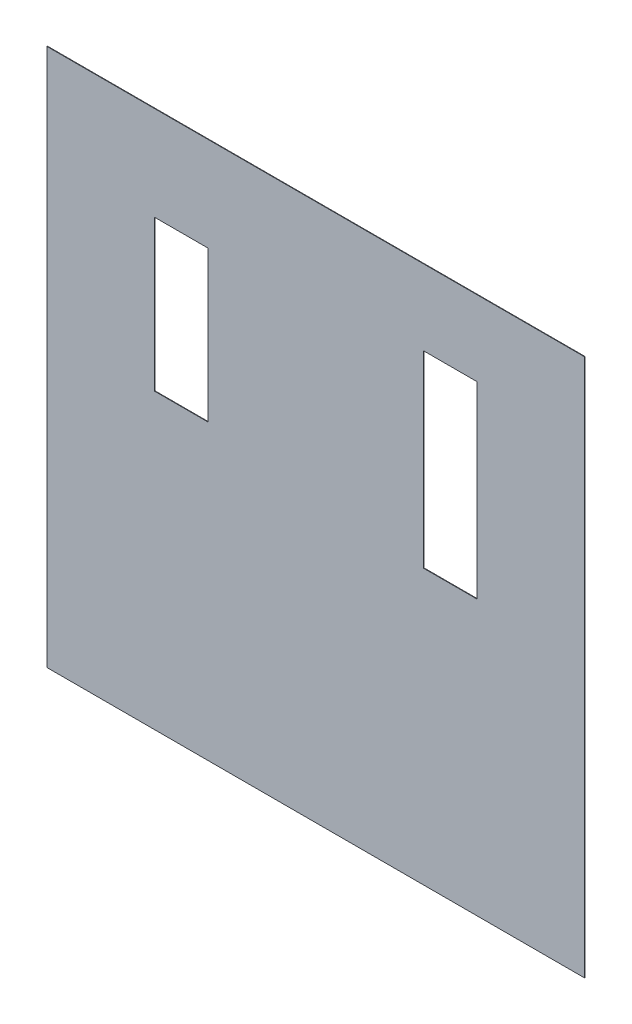
ISO-10303-21;
HEADER;
FILE_DESCRIPTION(('STEP AP214'),'2;1');
FILE_NAME('part.step','',(''),(''),'','','');
FILE_SCHEMA(('AUTOMOTIVE_DESIGN { 1 0 10303 214 1 1 1 1 }'));
ENDSEC;
DATA;
#1=APPLICATION_CONTEXT('core data for automotive mechanical design processes');
#2=APPLICATION_PROTOCOL_DEFINITION('international standard','automotive_design',2000,#1);
#3=PRODUCT_CONTEXT('',#1,'mechanical');
#4=PRODUCT('Part','Part','',(#3));
#5=PRODUCT_RELATED_PRODUCT_CATEGORY('part','',(#4));
#6=PRODUCT_DEFINITION_FORMATION('','',#4);
#7=PRODUCT_DEFINITION_CONTEXT('part definition',#1,'design');
#8=PRODUCT_DEFINITION('design','',#6,#7);
#9=PRODUCT_DEFINITION_SHAPE('','',#8);
#10=(LENGTH_UNIT() NAMED_UNIT(*) SI_UNIT(.MILLI.,.METRE.));
#11=(NAMED_UNIT(*) PLANE_ANGLE_UNIT() SI_UNIT($,.RADIAN.));
#12=(NAMED_UNIT(*) SI_UNIT($,.STERADIAN.) SOLID_ANGLE_UNIT());
#13=UNCERTAINTY_MEASURE_WITH_UNIT(LENGTH_MEASURE(1.E-05),#10,'distance_accuracy_value','');
#14=(GEOMETRIC_REPRESENTATION_CONTEXT(3) GLOBAL_UNCERTAINTY_ASSIGNED_CONTEXT((#13)) GLOBAL_UNIT_ASSIGNED_CONTEXT((#10,
#11,#12)) REPRESENTATION_CONTEXT('',''));
#15=CARTESIAN_POINT('',(0.,0.,0.));
#16=DIRECTION('',(0.,0.,1.));
#17=DIRECTION('',(1.,0.,0.));
#18=AXIS2_PLACEMENT_3D('',#15,#16,#17);
#19=CARTESIAN_POINT('',(0.,0.,0.0254));
#20=DIRECTION('',(1.,0.,0.));
#21=DIRECTION('',(0.,0.,-1.));
#22=AXIS2_PLACEMENT_3D('',#19,#20,#21);
#23=PLANE('',#22);
#24=DIRECTION('',(0.,-1.,0.));
#25=VECTOR('',#24,1.);
#26=CARTESIAN_POINT('',(0.,0.,0.));
#27=LINE('',#26,#25);
#28=CARTESIAN_POINT('',(0.,25.4,0.));
#29=VERTEX_POINT('',#28);
#30=CARTESIAN_POINT('',(0.,0.,0.));
#31=VERTEX_POINT('',#30);
#32=EDGE_CURVE('E183',#29,#31,#27,.T.);
#33=ORIENTED_EDGE('',*,*,#32,.T.);
#34=DIRECTION('',(0.,0.,-1.));
#35=VECTOR('',#34,1.);
#36=CARTESIAN_POINT('',(0.,0.,0.0254));
#37=LINE('',#36,#35);
#38=CARTESIAN_POINT('',(0.,0.,0.0254));
#39=VERTEX_POINT('',#38);
#40=EDGE_CURVE('E11',#39,#31,#37,.T.);
#41=ORIENTED_EDGE('',*,*,#40,.F.);
#42=DIRECTION('',(0.,-1.,0.));
#43=VECTOR('',#42,1.);
#44=CARTESIAN_POINT('',(0.,0.,0.0254));
#45=LINE('',#44,#43);
#46=CARTESIAN_POINT('',(0.,25.4,0.0254));
#47=VERTEX_POINT('',#46);
#48=EDGE_CURVE('E190',#47,#39,#45,.T.);
#49=ORIENTED_EDGE('',*,*,#48,.F.);
#50=DIRECTION('',(0.,0.,-1.));
#51=VECTOR('',#50,1.);
#52=CARTESIAN_POINT('',(0.,25.4,0.0254));
#53=LINE('',#52,#51);
#54=EDGE_CURVE('E200',#47,#29,#53,.T.);
#55=ORIENTED_EDGE('',*,*,#54,.T.);
#56=EDGE_LOOP('',(#33,#41,#49,#55));
#57=FACE_BOUND('',#56,.T.);
#58=ADVANCED_FACE('F33',(#57),#23,.F.);
#59=CARTESIAN_POINT('',(0.,0.,0.0254));
#60=DIRECTION('',(0.,1.,0.));
#61=DIRECTION('',(0.,0.,1.));
#62=AXIS2_PLACEMENT_3D('',#59,#60,#61);
#63=PLANE('',#62);
#64=DIRECTION('',(1.,0.,0.));
#65=VECTOR('',#64,1.);
#66=CARTESIAN_POINT('',(0.,0.,0.));
#67=LINE('',#66,#65);
#68=CARTESIAN_POINT('',(25.4,0.,0.));
#69=VERTEX_POINT('',#68);
#70=EDGE_CURVE('E203',#31,#69,#67,.T.);
#71=ORIENTED_EDGE('',*,*,#70,.T.);
#72=DIRECTION('',(0.,0.,-1.));
#73=VECTOR('',#72,1.);
#74=CARTESIAN_POINT('',(25.4,0.,0.0254));
#75=LINE('',#74,#73);
#76=CARTESIAN_POINT('',(25.4,0.,0.0254));
#77=VERTEX_POINT('',#76);
#78=EDGE_CURVE('E40',#77,#69,#75,.T.);
#79=ORIENTED_EDGE('',*,*,#78,.F.);
#80=DIRECTION('',(1.,0.,0.));
#81=VECTOR('',#80,1.);
#82=CARTESIAN_POINT('',(0.,0.,0.0254));
#83=LINE('',#82,#81);
#84=EDGE_CURVE('E193',#39,#77,#83,.T.);
#85=ORIENTED_EDGE('',*,*,#84,.F.);
#86=ORIENTED_EDGE('',*,*,#40,.T.);
#87=EDGE_LOOP('',(#71,#79,#85,#86));
#88=FACE_BOUND('',#87,.T.);
#89=ADVANCED_FACE('F232',(#88),#63,.F.);
#90=CARTESIAN_POINT('',(25.4,0.,0.0254));
#91=DIRECTION('',(-1.,0.,0.));
#92=DIRECTION('',(0.,0.,1.));
#93=AXIS2_PLACEMENT_3D('',#90,#91,#92);
#94=PLANE('',#93);
#95=DIRECTION('',(0.,1.,0.));
#96=VECTOR('',#95,1.);
#97=CARTESIAN_POINT('',(25.4,0.,0.));
#98=LINE('',#97,#96);
#99=CARTESIAN_POINT('',(25.4,25.4,0.));
#100=VERTEX_POINT('',#99);
#101=EDGE_CURVE('E205',#69,#100,#98,.T.);
#102=ORIENTED_EDGE('',*,*,#101,.T.);
#103=DIRECTION('',(0.,0.,-1.));
#104=VECTOR('',#103,1.);
#105=CARTESIAN_POINT('',(25.4,25.4,0.0254));
#106=LINE('',#105,#104);
#107=CARTESIAN_POINT('',(25.4,25.4,0.0254));
#108=VERTEX_POINT('',#107);
#109=EDGE_CURVE('E210',#108,#100,#106,.T.);
#110=ORIENTED_EDGE('',*,*,#109,.F.);
#111=DIRECTION('',(0.,1.,0.));
#112=VECTOR('',#111,1.);
#113=CARTESIAN_POINT('',(25.4,0.,0.0254));
#114=LINE('',#113,#112);
#115=EDGE_CURVE('E196',#77,#108,#114,.T.);
#116=ORIENTED_EDGE('',*,*,#115,.F.);
#117=ORIENTED_EDGE('',*,*,#78,.T.);
#118=EDGE_LOOP('',(#102,#110,#116,#117));
#119=FACE_BOUND('',#118,.T.);
#120=ADVANCED_FACE('F217',(#119),#94,.F.);
#121=CARTESIAN_POINT('',(0.,25.4,0.0254));
#122=DIRECTION('',(0.,-1.,0.));
#123=DIRECTION('',(0.,0.,-1.));
#124=AXIS2_PLACEMENT_3D('',#121,#122,#123);
#125=PLANE('',#124);
#126=DIRECTION('',(-1.,0.,0.));
#127=VECTOR('',#126,1.);
#128=CARTESIAN_POINT('',(0.,25.4,0.));
#129=LINE('',#128,#127);
#130=EDGE_CURVE('E194',#100,#29,#129,.T.);
#131=ORIENTED_EDGE('',*,*,#130,.T.);
#132=ORIENTED_EDGE('',*,*,#54,.F.);
#133=DIRECTION('',(-1.,0.,0.));
#134=VECTOR('',#133,1.);
#135=CARTESIAN_POINT('',(0.,25.4,0.0254));
#136=LINE('',#135,#134);
#137=EDGE_CURVE('E198',#108,#47,#136,.T.);
#138=ORIENTED_EDGE('',*,*,#137,.F.);
#139=ORIENTED_EDGE('',*,*,#109,.T.);
#140=EDGE_LOOP('',(#131,#132,#138,#139));
#141=FACE_BOUND('',#140,.T.);
#142=ADVANCED_FACE('F225',(#141),#125,.F.);
#143=CARTESIAN_POINT('',(0.,0.,0.0254));
#144=DIRECTION('',(0.,0.,-1.));
#145=DIRECTION('',(-1.,0.,0.));
#146=AXIS2_PLACEMENT_3D('',#143,#144,#145);
#147=PLANE('',#146);
#148=DIRECTION('',(1.,0.,0.));
#149=VECTOR('',#148,1.);
#150=CARTESIAN_POINT('',(17.78,12.954,0.0254));
#151=LINE('',#150,#149);
#152=CARTESIAN_POINT('',(17.78,12.954,0.0254));
#153=VERTEX_POINT('',#152);
#154=CARTESIAN_POINT('',(20.32,12.954,0.0254));
#155=VERTEX_POINT('',#154);
#156=EDGE_CURVE('E148',#153,#155,#151,.T.);
#157=ORIENTED_EDGE('',*,*,#156,.F.);
#158=DIRECTION('',(0.,-1.,0.));
#159=VECTOR('',#158,1.);
#160=CARTESIAN_POINT('',(17.78,21.844,0.0254));
#161=LINE('',#160,#159);
#162=CARTESIAN_POINT('',(17.78,21.844,0.0254));
#163=VERTEX_POINT('',#162);
#164=EDGE_CURVE('E47',#163,#153,#161,.T.);
#165=ORIENTED_EDGE('',*,*,#164,.F.);
#166=DIRECTION('',(-1.,0.,0.));
#167=VECTOR('',#166,1.);
#168=CARTESIAN_POINT('',(17.78,21.844,0.0254));
#169=LINE('',#168,#167);
#170=CARTESIAN_POINT('',(20.32,21.844,0.0254));
#171=VERTEX_POINT('',#170);
#172=EDGE_CURVE('E139',#171,#163,#169,.T.);
#173=ORIENTED_EDGE('',*,*,#172,.F.);
#174=DIRECTION('',(0.,1.,0.));
#175=VECTOR('',#174,1.);
#176=CARTESIAN_POINT('',(20.32,21.844,0.0254));
#177=LINE('',#176,#175);
#178=EDGE_CURVE('E142',#155,#171,#177,.T.);
#179=ORIENTED_EDGE('',*,*,#178,.F.);
#180=EDGE_LOOP('',(#157,#165,#173,#179));
#181=FACE_BOUND('',#180,.T.);
#182=DIRECTION('',(1.,0.,0.));
#183=VECTOR('',#182,1.);
#184=CARTESIAN_POINT('',(5.08,13.843,0.0254));
#185=LINE('',#184,#183);
#186=CARTESIAN_POINT('',(5.08,13.843,0.0254));
#187=VERTEX_POINT('',#186);
#188=CARTESIAN_POINT('',(7.62,13.843,0.0254));
#189=VERTEX_POINT('',#188);
#190=EDGE_CURVE('E173',#187,#189,#185,.T.);
#191=ORIENTED_EDGE('',*,*,#190,.F.);
#192=DIRECTION('',(0.,-1.,0.));
#193=VECTOR('',#192,1.);
#194=CARTESIAN_POINT('',(5.08,20.955,0.0254));
#195=LINE('',#194,#193);
#196=CARTESIAN_POINT('',(5.08,20.955,0.0254));
#197=VERTEX_POINT('',#196);
#198=EDGE_CURVE('E154',#197,#187,#195,.T.);
#199=ORIENTED_EDGE('',*,*,#198,.F.);
#200=DIRECTION('',(-1.,0.,0.));
#201=VECTOR('',#200,1.);
#202=CARTESIAN_POINT('',(5.08,20.955,0.0254));
#203=LINE('',#202,#201);
#204=CARTESIAN_POINT('',(7.62,20.955,0.0254));
#205=VERTEX_POINT('',#204);
#206=EDGE_CURVE('E162',#205,#197,#203,.T.);
#207=ORIENTED_EDGE('',*,*,#206,.F.);
#208=DIRECTION('',(0.,1.,0.));
#209=VECTOR('',#208,1.);
#210=CARTESIAN_POINT('',(7.62,20.955,0.0254));
#211=LINE('',#210,#209);
#212=EDGE_CURVE('E176',#189,#205,#211,.T.);
#213=ORIENTED_EDGE('',*,*,#212,.F.);
#214=EDGE_LOOP('',(#191,#199,#207,#213));
#215=FACE_BOUND('',#214,.T.);
#216=ORIENTED_EDGE('',*,*,#48,.T.);
#217=ORIENTED_EDGE('',*,*,#84,.T.);
#218=ORIENTED_EDGE('',*,*,#115,.T.);
#219=ORIENTED_EDGE('',*,*,#137,.T.);
#220=EDGE_LOOP('',(#216,#217,#218,#219));
#221=FACE_BOUND('',#220,.T.);
#222=ADVANCED_FACE('F231',(#181,#215,#221),#147,.F.);
#223=CARTESIAN_POINT('',(0.,0.,0.));
#224=DIRECTION('',(0.,0.,-1.));
#225=DIRECTION('',(-1.,0.,0.));
#226=AXIS2_PLACEMENT_3D('',#223,#224,#225);
#227=PLANE('',#226);
#228=DIRECTION('',(0.,-1.,0.));
#229=VECTOR('',#228,1.);
#230=CARTESIAN_POINT('',(17.78,21.844,0.));
#231=LINE('',#230,#229);
#232=CARTESIAN_POINT('',(17.78,21.844,0.));
#233=VERTEX_POINT('',#232);
#234=CARTESIAN_POINT('',(17.78,12.954,0.));
#235=VERTEX_POINT('',#234);
#236=EDGE_CURVE('E123',#233,#235,#231,.T.);
#237=ORIENTED_EDGE('',*,*,#236,.T.);
#238=DIRECTION('',(1.,0.,0.));
#239=VECTOR('',#238,1.);
#240=CARTESIAN_POINT('',(17.78,12.954,0.));
#241=LINE('',#240,#239);
#242=CARTESIAN_POINT('',(20.32,12.954,0.));
#243=VERTEX_POINT('',#242);
#244=EDGE_CURVE('E132',#235,#243,#241,.T.);
#245=ORIENTED_EDGE('',*,*,#244,.T.);
#246=DIRECTION('',(0.,1.,0.));
#247=VECTOR('',#246,1.);
#248=CARTESIAN_POINT('',(20.32,21.844,0.));
#249=LINE('',#248,#247);
#250=CARTESIAN_POINT('',(20.32,21.844,0.));
#251=VERTEX_POINT('',#250);
#252=EDGE_CURVE('E55',#243,#251,#249,.T.);
#253=ORIENTED_EDGE('',*,*,#252,.T.);
#254=DIRECTION('',(-1.,0.,0.));
#255=VECTOR('',#254,1.);
#256=CARTESIAN_POINT('',(17.78,21.844,0.));
#257=LINE('',#256,#255);
#258=EDGE_CURVE('E129',#251,#233,#257,.T.);
#259=ORIENTED_EDGE('',*,*,#258,.T.);
#260=EDGE_LOOP('',(#237,#245,#253,#259));
#261=FACE_BOUND('',#260,.T.);
#262=DIRECTION('',(0.,-1.,0.));
#263=VECTOR('',#262,1.);
#264=CARTESIAN_POINT('',(5.08,20.955,0.));
#265=LINE('',#264,#263);
#266=CARTESIAN_POINT('',(5.08,20.955,0.));
#267=VERTEX_POINT('',#266);
#268=CARTESIAN_POINT('',(5.08,13.843,0.));
#269=VERTEX_POINT('',#268);
#270=EDGE_CURVE('E158',#267,#269,#265,.T.);
#271=ORIENTED_EDGE('',*,*,#270,.T.);
#272=DIRECTION('',(1.,0.,0.));
#273=VECTOR('',#272,1.);
#274=CARTESIAN_POINT('',(5.08,13.843,0.));
#275=LINE('',#274,#273);
#276=CARTESIAN_POINT('',(7.62,13.843,0.));
#277=VERTEX_POINT('',#276);
#278=EDGE_CURVE('E161',#269,#277,#275,.T.);
#279=ORIENTED_EDGE('',*,*,#278,.T.);
#280=DIRECTION('',(0.,1.,0.));
#281=VECTOR('',#280,1.);
#282=CARTESIAN_POINT('',(7.62,20.955,0.));
#283=LINE('',#282,#281);
#284=CARTESIAN_POINT('',(7.62,20.955,0.));
#285=VERTEX_POINT('',#284);
#286=EDGE_CURVE('E165',#277,#285,#283,.T.);
#287=ORIENTED_EDGE('',*,*,#286,.T.);
#288=DIRECTION('',(-1.,0.,0.));
#289=VECTOR('',#288,1.);
#290=CARTESIAN_POINT('',(5.08,20.955,0.));
#291=LINE('',#290,#289);
#292=EDGE_CURVE('E168',#285,#267,#291,.T.);
#293=ORIENTED_EDGE('',*,*,#292,.T.);
#294=EDGE_LOOP('',(#271,#279,#287,#293));
#295=FACE_BOUND('',#294,.T.);
#296=ORIENTED_EDGE('',*,*,#32,.F.);
#297=ORIENTED_EDGE('',*,*,#130,.F.);
#298=ORIENTED_EDGE('',*,*,#101,.F.);
#299=ORIENTED_EDGE('',*,*,#70,.F.);
#300=EDGE_LOOP('',(#296,#297,#298,#299));
#301=FACE_BOUND('',#300,.T.);
#302=ADVANCED_FACE('F136',(#261,#295,#301),#227,.T.);
#303=CARTESIAN_POINT('',(5.08,20.955,0.));
#304=DIRECTION('',(-1.,0.,0.));
#305=DIRECTION('',(0.,-1.,0.));
#306=AXIS2_PLACEMENT_3D('',#303,#304,#305);
#307=PLANE('',#306);
#308=ORIENTED_EDGE('',*,*,#198,.T.);
#309=DIRECTION('',(0.,0.,1.));
#310=VECTOR('',#309,1.);
#311=CARTESIAN_POINT('',(5.08,13.843,0.));
#312=LINE('',#311,#310);
#313=EDGE_CURVE('E171',#269,#187,#312,.T.);
#314=ORIENTED_EDGE('',*,*,#313,.F.);
#315=ORIENTED_EDGE('',*,*,#270,.F.);
#316=DIRECTION('',(0.,0.,1.));
#317=VECTOR('',#316,1.);
#318=CARTESIAN_POINT('',(5.08,20.955,0.));
#319=LINE('',#318,#317);
#320=EDGE_CURVE('E181',#267,#197,#319,.T.);
#321=ORIENTED_EDGE('',*,*,#320,.T.);
#322=EDGE_LOOP('',(#308,#314,#315,#321));
#323=FACE_BOUND('',#322,.T.);
#324=ADVANCED_FACE('F244',(#323),#307,.F.);
#325=CARTESIAN_POINT('',(5.08,20.955,0.));
#326=DIRECTION('',(0.,1.,0.));
#327=DIRECTION('',(0.,0.,1.));
#328=AXIS2_PLACEMENT_3D('',#325,#326,#327);
#329=PLANE('',#328);
#330=ORIENTED_EDGE('',*,*,#206,.T.);
#331=ORIENTED_EDGE('',*,*,#320,.F.);
#332=ORIENTED_EDGE('',*,*,#292,.F.);
#333=DIRECTION('',(0.,0.,1.));
#334=VECTOR('',#333,1.);
#335=CARTESIAN_POINT('',(7.62,20.955,0.));
#336=LINE('',#335,#334);
#337=EDGE_CURVE('E184',#285,#205,#336,.T.);
#338=ORIENTED_EDGE('',*,*,#337,.T.);
#339=EDGE_LOOP('',(#330,#331,#332,#338));
#340=FACE_BOUND('',#339,.T.);
#341=ADVANCED_FACE('F250',(#340),#329,.F.);
#342=CARTESIAN_POINT('',(7.62,20.955,0.));
#343=DIRECTION('',(1.,0.,0.));
#344=DIRECTION('',(0.,1.,0.));
#345=AXIS2_PLACEMENT_3D('',#342,#343,#344);
#346=PLANE('',#345);
#347=ORIENTED_EDGE('',*,*,#212,.T.);
#348=ORIENTED_EDGE('',*,*,#337,.F.);
#349=ORIENTED_EDGE('',*,*,#286,.F.);
#350=DIRECTION('',(0.,0.,1.));
#351=VECTOR('',#350,1.);
#352=CARTESIAN_POINT('',(7.62,13.843,0.));
#353=LINE('',#352,#351);
#354=EDGE_CURVE('E186',#277,#189,#353,.T.);
#355=ORIENTED_EDGE('',*,*,#354,.T.);
#356=EDGE_LOOP('',(#347,#348,#349,#355));
#357=FACE_BOUND('',#356,.T.);
#358=ADVANCED_FACE('F255',(#357),#346,.F.);
#359=CARTESIAN_POINT('',(5.08,13.843,0.));
#360=DIRECTION('',(0.,-1.,0.));
#361=DIRECTION('',(0.,0.,-1.));
#362=AXIS2_PLACEMENT_3D('',#359,#360,#361);
#363=PLANE('',#362);
#364=ORIENTED_EDGE('',*,*,#190,.T.);
#365=ORIENTED_EDGE('',*,*,#354,.F.);
#366=ORIENTED_EDGE('',*,*,#278,.F.);
#367=ORIENTED_EDGE('',*,*,#313,.T.);
#368=EDGE_LOOP('',(#364,#365,#366,#367));
#369=FACE_BOUND('',#368,.T.);
#370=ADVANCED_FACE('F252',(#369),#363,.F.);
#371=CARTESIAN_POINT('',(17.78,21.844,0.));
#372=DIRECTION('',(-1.,0.,0.));
#373=DIRECTION('',(0.,-1.,0.));
#374=AXIS2_PLACEMENT_3D('',#371,#372,#373);
#375=PLANE('',#374);
#376=ORIENTED_EDGE('',*,*,#164,.T.);
#377=DIRECTION('',(0.,0.,1.));
#378=VECTOR('',#377,1.);
#379=CARTESIAN_POINT('',(17.78,12.954,0.));
#380=LINE('',#379,#378);
#381=EDGE_CURVE('E119',#235,#153,#380,.T.);
#382=ORIENTED_EDGE('',*,*,#381,.F.);
#383=ORIENTED_EDGE('',*,*,#236,.F.);
#384=DIRECTION('',(0.,0.,1.));
#385=VECTOR('',#384,1.);
#386=CARTESIAN_POINT('',(17.78,21.844,0.));
#387=LINE('',#386,#385);
#388=EDGE_CURVE('E152',#233,#163,#387,.T.);
#389=ORIENTED_EDGE('',*,*,#388,.T.);
#390=EDGE_LOOP('',(#376,#382,#383,#389));
#391=FACE_BOUND('',#390,.T.);
#392=ADVANCED_FACE('F121',(#391),#375,.F.);
#393=CARTESIAN_POINT('',(17.78,21.844,0.));
#394=DIRECTION('',(0.,1.,0.));
#395=DIRECTION('',(0.,0.,1.));
#396=AXIS2_PLACEMENT_3D('',#393,#394,#395);
#397=PLANE('',#396);
#398=ORIENTED_EDGE('',*,*,#172,.T.);
#399=ORIENTED_EDGE('',*,*,#388,.F.);
#400=ORIENTED_EDGE('',*,*,#258,.F.);
#401=DIRECTION('',(0.,0.,1.));
#402=VECTOR('',#401,1.);
#403=CARTESIAN_POINT('',(20.32,21.844,0.));
#404=LINE('',#403,#402);
#405=EDGE_CURVE('E155',#251,#171,#404,.T.);
#406=ORIENTED_EDGE('',*,*,#405,.T.);
#407=EDGE_LOOP('',(#398,#399,#400,#406));
#408=FACE_BOUND('',#407,.T.);
#409=ADVANCED_FACE('F265',(#408),#397,.F.);
#410=CARTESIAN_POINT('',(20.32,21.844,0.));
#411=DIRECTION('',(1.,0.,0.));
#412=DIRECTION('',(0.,0.,-1.));
#413=AXIS2_PLACEMENT_3D('',#410,#411,#412);
#414=PLANE('',#413);
#415=ORIENTED_EDGE('',*,*,#178,.T.);
#416=ORIENTED_EDGE('',*,*,#405,.F.);
#417=ORIENTED_EDGE('',*,*,#252,.F.);
#418=DIRECTION('',(0.,0.,1.));
#419=VECTOR('',#418,1.);
#420=CARTESIAN_POINT('',(20.32,12.954,0.));
#421=LINE('',#420,#419);
#422=EDGE_CURVE('E128',#243,#155,#421,.T.);
#423=ORIENTED_EDGE('',*,*,#422,.T.);
#424=EDGE_LOOP('',(#415,#416,#417,#423));
#425=FACE_BOUND('',#424,.T.);
#426=ADVANCED_FACE('F268',(#425),#414,.F.);
#427=CARTESIAN_POINT('',(17.78,12.954,0.));
#428=DIRECTION('',(0.,-1.,0.));
#429=DIRECTION('',(1.,0.,0.));
#430=AXIS2_PLACEMENT_3D('',#427,#428,#429);
#431=PLANE('',#430);
#432=ORIENTED_EDGE('',*,*,#156,.T.);
#433=ORIENTED_EDGE('',*,*,#422,.F.);
#434=ORIENTED_EDGE('',*,*,#244,.F.);
#435=ORIENTED_EDGE('',*,*,#381,.T.);
#436=EDGE_LOOP('',(#432,#433,#434,#435));
#437=FACE_BOUND('',#436,.T.);
#438=ADVANCED_FACE('F133',(#437),#431,.F.);
#439=CLOSED_SHELL('',(#58,#89,#120,#142,#222,#302,#324,#341,#358,#370,#392,#409,#426,#438));
#440=MANIFOLD_SOLID_BREP('B2',#439);
#441=ADVANCED_BREP_SHAPE_REPRESENTATION('',(#18,#440),#14);
#442=SHAPE_DEFINITION_REPRESENTATION(#9,#441);
ENDSEC;
END-ISO-10303-21;
